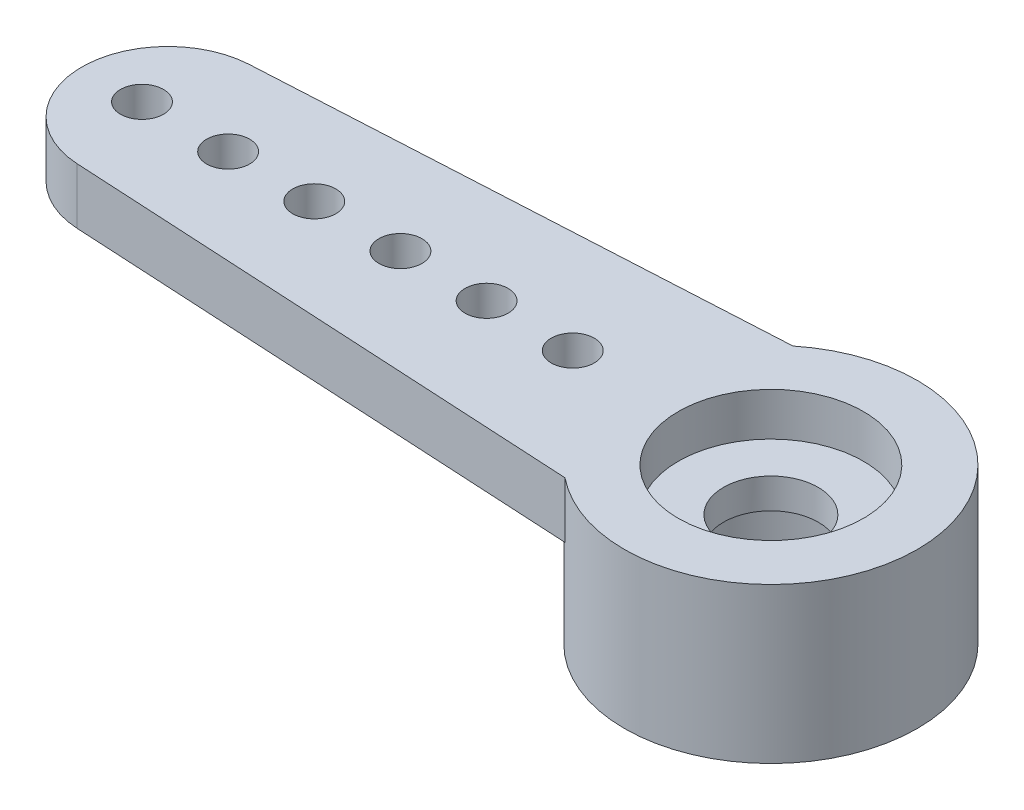
ISO-10303-21;
HEADER;
FILE_DESCRIPTION(('STEP AP214'),'2;1');
FILE_NAME('part.step','',(''),(''),'','','');
FILE_SCHEMA(('AUTOMOTIVE_DESIGN { 1 0 10303 214 1 1 1 1 }'));
ENDSEC;
DATA;
#1=APPLICATION_CONTEXT('core data for automotive mechanical design processes');
#2=APPLICATION_PROTOCOL_DEFINITION('international standard','automotive_design',2000,#1);
#3=PRODUCT_CONTEXT('',#1,'mechanical');
#4=PRODUCT('Part','Part','',(#3));
#5=PRODUCT_RELATED_PRODUCT_CATEGORY('part','',(#4));
#6=PRODUCT_DEFINITION_FORMATION('','',#4);
#7=PRODUCT_DEFINITION_CONTEXT('part definition',#1,'design');
#8=PRODUCT_DEFINITION('design','',#6,#7);
#9=PRODUCT_DEFINITION_SHAPE('','',#8);
#10=(LENGTH_UNIT() NAMED_UNIT(*) SI_UNIT(.MILLI.,.METRE.));
#11=(NAMED_UNIT(*) PLANE_ANGLE_UNIT() SI_UNIT($,.RADIAN.));
#12=(NAMED_UNIT(*) SI_UNIT($,.STERADIAN.) SOLID_ANGLE_UNIT());
#13=UNCERTAINTY_MEASURE_WITH_UNIT(LENGTH_MEASURE(1.E-05),#10,'distance_accuracy_value','');
#14=(GEOMETRIC_REPRESENTATION_CONTEXT(3) GLOBAL_UNCERTAINTY_ASSIGNED_CONTEXT((#13)) GLOBAL_UNIT_ASSIGNED_CONTEXT((#10,
#11,#12)) REPRESENTATION_CONTEXT('',''));
#15=CARTESIAN_POINT('',(0.,0.,0.));
#16=DIRECTION('',(0.,0.,1.));
#17=DIRECTION('',(1.,0.,0.));
#18=AXIS2_PLACEMENT_3D('',#15,#16,#17);
#19=CARTESIAN_POINT('',(5.9,-1.3,-5.67249409819933));
#20=DIRECTION('',(0.,1.,0.));
#21=DIRECTION('',(0.,0.,1.));
#22=AXIS2_PLACEMENT_3D('',#19,#20,#21);
#23=PLANE('',#22);
#24=CARTESIAN_POINT('',(-8.7,-1.3,-5.67249409819933));
#25=DIRECTION('',(0.,1.,0.));
#26=DIRECTION('',(0.,0.,1.));
#27=AXIS2_PLACEMENT_3D('',#24,#25,#26);
#28=CIRCLE('',#27,0.500000000000001);
#29=CARTESIAN_POINT('',(-8.7,-1.3,-5.17249409819933));
#30=VERTEX_POINT('',#29);
#31=EDGE_CURVE('E151',#30,#30,#28,.T.);
#32=ORIENTED_EDGE('',*,*,#31,.T.);
#33=EDGE_LOOP('',(#32));
#34=FACE_BOUND('',#33,.T.);
#35=CARTESIAN_POINT('',(1.3,-1.3,-5.67249409819933));
#36=DIRECTION('',(0.,1.,0.));
#37=DIRECTION('',(0.,0.,1.));
#38=AXIS2_PLACEMENT_3D('',#35,#36,#37);
#39=CIRCLE('',#38,0.500000000000001);
#40=CARTESIAN_POINT('',(1.3,-1.3,-5.17249409819933));
#41=VERTEX_POINT('',#40);
#42=EDGE_CURVE('E145',#41,#41,#39,.T.);
#43=ORIENTED_EDGE('',*,*,#42,.T.);
#44=EDGE_LOOP('',(#43));
#45=FACE_BOUND('',#44,.T.);
#46=CARTESIAN_POINT('',(-0.699999999999998,-1.3,-5.67249409819933));
#47=DIRECTION('',(0.,1.,0.));
#48=DIRECTION('',(0.,0.,1.));
#49=AXIS2_PLACEMENT_3D('',#46,#47,#48);
#50=CIRCLE('',#49,0.500000000000001);
#51=CARTESIAN_POINT('',(-0.699999999999998,-1.3,-5.17249409819933));
#52=VERTEX_POINT('',#51);
#53=EDGE_CURVE('E139',#52,#52,#50,.T.);
#54=ORIENTED_EDGE('',*,*,#53,.T.);
#55=EDGE_LOOP('',(#54));
#56=FACE_BOUND('',#55,.T.);
#57=CARTESIAN_POINT('',(-2.7,-1.3,-5.67249409819933));
#58=DIRECTION('',(0.,1.,0.));
#59=DIRECTION('',(0.,0.,1.));
#60=AXIS2_PLACEMENT_3D('',#57,#58,#59);
#61=CIRCLE('',#60,0.5);
#62=CARTESIAN_POINT('',(-2.7,-1.3,-5.17249409819933));
#63=VERTEX_POINT('',#62);
#64=EDGE_CURVE('E133',#63,#63,#61,.T.);
#65=ORIENTED_EDGE('',*,*,#64,.T.);
#66=EDGE_LOOP('',(#65));
#67=FACE_BOUND('',#66,.T.);
#68=CARTESIAN_POINT('',(-4.7,-1.3,-5.67249409819933));
#69=DIRECTION('',(0.,1.,0.));
#70=DIRECTION('',(0.,0.,1.));
#71=AXIS2_PLACEMENT_3D('',#68,#69,#70);
#72=CIRCLE('',#71,0.500000000000001);
#73=CARTESIAN_POINT('',(-4.7,-1.3,-5.17249409819933));
#74=VERTEX_POINT('',#73);
#75=EDGE_CURVE('E127',#74,#74,#72,.T.);
#76=ORIENTED_EDGE('',*,*,#75,.T.);
#77=EDGE_LOOP('',(#76));
#78=FACE_BOUND('',#77,.T.);
#79=CARTESIAN_POINT('',(-6.7,-1.3,-5.67249409819933));
#80=DIRECTION('',(0.,1.,0.));
#81=DIRECTION('',(0.,0.,1.));
#82=AXIS2_PLACEMENT_3D('',#79,#80,#81);
#83=CIRCLE('',#82,0.500000000000001);
#84=CARTESIAN_POINT('',(-6.7,-1.3,-5.17249409819933));
#85=VERTEX_POINT('',#84);
#86=EDGE_CURVE('E120',#85,#85,#83,.T.);
#87=ORIENTED_EDGE('',*,*,#86,.T.);
#88=EDGE_LOOP('',(#87));
#89=FACE_BOUND('',#88,.T.);
#90=CARTESIAN_POINT('',(5.9,-1.3,-5.67249409819933));
#91=DIRECTION('',(0.,-1.,0.));
#92=DIRECTION('',(0.,0.,-1.));
#93=AXIS2_PLACEMENT_3D('',#90,#91,#92);
#94=CIRCLE('',#93,3.40000000000004);
#95=CARTESIAN_POINT('',(3.76674544416284,-1.3,-3.025));
#96=VERTEX_POINT('',#95);
#97=CARTESIAN_POINT('',(3.76674544416284,-1.3,-8.31998819639866));
#98=VERTEX_POINT('',#97);
#99=EDGE_CURVE('E75',#96,#98,#94,.T.);
#100=ORIENTED_EDGE('',*,*,#99,.F.);
#101=DIRECTION('',(0.998528178597838,0.,0.0542353809434821));
#102=VECTOR('',#101,1.);
#103=CARTESIAN_POINT('',(-8.20847076188695,-1.3,-3.67543774100366));
#104=LINE('',#103,#102);
#105=CARTESIAN_POINT('',(-8.20847076188695,-1.3,-3.67543774100365));
#106=VERTEX_POINT('',#105);
#107=EDGE_CURVE('E82',#106,#96,#104,.T.);
#108=ORIENTED_EDGE('',*,*,#107,.F.);
#109=CARTESIAN_POINT('',(-8.09999999999999,-1.3,-5.67249409819933));
#110=DIRECTION('',(0.,1.,0.));
#111=DIRECTION('',(0.,0.,1.));
#112=AXIS2_PLACEMENT_3D('',#109,#110,#111);
#113=CIRCLE('',#112,2.);
#114=CARTESIAN_POINT('',(-8.20847076188695,-1.3,-7.66955045539501));
#115=VERTEX_POINT('',#114);
#116=EDGE_CURVE('E94',#115,#106,#113,.T.);
#117=ORIENTED_EDGE('',*,*,#116,.F.);
#118=DIRECTION('',(-0.998528178597838,0.,0.0542353809434817));
#119=VECTOR('',#118,1.);
#120=CARTESIAN_POINT('',(3.76674544416284,-1.3,-8.31998819639866));
#121=LINE('',#120,#119);
#122=EDGE_CURVE('E84',#98,#115,#121,.T.);
#123=ORIENTED_EDGE('',*,*,#122,.F.);
#124=EDGE_LOOP('',(#100,#108,#117,#123));
#125=FACE_BOUND('',#124,.T.);
#126=ADVANCED_FACE('F35',(#34,#45,#56,#67,#78,#89,#125),#23,.F.);
#127=CARTESIAN_POINT('',(5.9,-1.3,-5.67249409819933));
#128=DIRECTION('',(0.,1.,0.));
#129=DIRECTION('',(0.,0.,1.));
#130=AXIS2_PLACEMENT_3D('',#127,#128,#129);
#131=CYLINDRICAL_SURFACE('',#130,1.1);
#132=CARTESIAN_POINT('',(5.9,-1.,-5.67249409819933));
#133=DIRECTION('',(0.,1.,0.));
#134=DIRECTION('',(0.,0.,1.));
#135=AXIS2_PLACEMENT_3D('',#132,#133,#134);
#136=CIRCLE('',#135,1.1);
#137=CARTESIAN_POINT('',(5.9,-1.,-4.57249409819933));
#138=VERTEX_POINT('',#137);
#139=EDGE_CURVE('E109',#138,#138,#136,.F.);
#140=ORIENTED_EDGE('',*,*,#139,.F.);
#141=EDGE_LOOP('',(#140));
#142=FACE_BOUND('',#141,.T.);
#143=CARTESIAN_POINT('',(5.9,-1.7,-5.67249409819933));
#144=DIRECTION('',(0.,-1.,0.));
#145=DIRECTION('',(0.,0.,-1.));
#146=AXIS2_PLACEMENT_3D('',#143,#144,#145);
#147=CIRCLE('',#146,1.1);
#148=CARTESIAN_POINT('',(5.9,-1.7,-6.77249409819933));
#149=VERTEX_POINT('',#148);
#150=EDGE_CURVE('E237',#149,#149,#147,.F.);
#151=ORIENTED_EDGE('',*,*,#150,.F.);
#152=EDGE_LOOP('',(#151));
#153=FACE_BOUND('',#152,.T.);
#154=ADVANCED_FACE('F185',(#142,#153),#131,.F.);
#155=CARTESIAN_POINT('',(5.9,-1.3,-5.67249409819933));
#156=DIRECTION('',(0.,1.,0.));
#157=DIRECTION('',(0.,0.,1.));
#158=AXIS2_PLACEMENT_3D('',#155,#156,#157);
#159=CYLINDRICAL_SURFACE('',#158,3.40000000000004);
#160=CARTESIAN_POINT('',(5.9,0.,-5.67249409819933));
#161=DIRECTION('',(0.,1.,0.));
#162=DIRECTION('',(0.,0.,1.));
#163=AXIS2_PLACEMENT_3D('',#160,#161,#162);
#164=CIRCLE('',#163,3.40000000000004);
#165=CARTESIAN_POINT('',(3.76674544416284,0.,-3.025));
#166=VERTEX_POINT('',#165);
#167=CARTESIAN_POINT('',(3.76674544416284,0.,-8.31998819639866));
#168=VERTEX_POINT('',#167);
#169=EDGE_CURVE('E90',#166,#168,#164,.T.);
#170=ORIENTED_EDGE('',*,*,#169,.F.);
#171=DIRECTION('',(0.,1.,0.));
#172=VECTOR('',#171,1.);
#173=CARTESIAN_POINT('',(3.76674544416284,-1.3,-3.025));
#174=LINE('',#173,#172);
#175=EDGE_CURVE('E12',#96,#166,#174,.T.);
#176=ORIENTED_EDGE('',*,*,#175,.F.);
#177=ORIENTED_EDGE('',*,*,#99,.T.);
#178=DIRECTION('',(0.,1.,0.));
#179=VECTOR('',#178,1.);
#180=CARTESIAN_POINT('',(3.76674544416284,-1.3,-8.31998819639866));
#181=LINE('',#180,#179);
#182=EDGE_CURVE('E93',#98,#168,#181,.T.);
#183=ORIENTED_EDGE('',*,*,#182,.T.);
#184=EDGE_LOOP('',(#170,#176,#177,#183));
#185=FACE_BOUND('',#184,.T.);
#186=CARTESIAN_POINT('',(5.9,-3.6,-5.67249409819933));
#187=DIRECTION('',(0.,1.,0.));
#188=DIRECTION('',(0.,0.,1.));
#189=AXIS2_PLACEMENT_3D('',#186,#187,#188);
#190=CIRCLE('',#189,3.40000000000004);
#191=CARTESIAN_POINT('',(5.9,-3.6,-2.27249409819929));
#192=VERTEX_POINT('',#191);
#193=EDGE_CURVE('E85',#192,#192,#190,.T.);
#194=ORIENTED_EDGE('',*,*,#193,.T.);
#195=EDGE_LOOP('',(#194));
#196=FACE_BOUND('',#195,.T.);
#197=ADVANCED_FACE('F37',(#185,#196),#159,.T.);
#198=CARTESIAN_POINT('',(-8.20847076188695,-1.3,-3.67543774100366));
#199=DIRECTION('',(-0.0542353809434821,0.,0.998528178597838));
#200=DIRECTION('',(0.998528178597838,0.,0.0542353809434821));
#201=AXIS2_PLACEMENT_3D('',#198,#199,#200);
#202=PLANE('',#201);
#203=DIRECTION('',(0.998528178597838,0.,0.0542353809434821));
#204=VECTOR('',#203,1.);
#205=CARTESIAN_POINT('',(-8.20847076188695,0.,-3.67543774100366));
#206=LINE('',#205,#204);
#207=CARTESIAN_POINT('',(-8.20847076188695,0.,-3.67543774100365));
#208=VERTEX_POINT('',#207);
#209=EDGE_CURVE('E104',#208,#166,#206,.T.);
#210=ORIENTED_EDGE('',*,*,#209,.F.);
#211=DIRECTION('',(0.,1.,0.));
#212=VECTOR('',#211,1.);
#213=CARTESIAN_POINT('',(-8.20847076188695,-1.3,-3.67543774100365));
#214=LINE('',#213,#212);
#215=EDGE_CURVE('E45',#106,#208,#214,.T.);
#216=ORIENTED_EDGE('',*,*,#215,.F.);
#217=ORIENTED_EDGE('',*,*,#107,.T.);
#218=ORIENTED_EDGE('',*,*,#175,.T.);
#219=EDGE_LOOP('',(#210,#216,#217,#218));
#220=FACE_BOUND('',#219,.T.);
#221=ADVANCED_FACE('F92',(#220),#202,.T.);
#222=CARTESIAN_POINT('',(-8.09999999999999,-1.3,-5.67249409819933));
#223=DIRECTION('',(0.,1.,0.));
#224=DIRECTION('',(0.,0.,1.));
#225=AXIS2_PLACEMENT_3D('',#222,#223,#224);
#226=CYLINDRICAL_SURFACE('',#225,2.);
#227=CARTESIAN_POINT('',(-8.09999999999999,0.,-5.67249409819933));
#228=DIRECTION('',(0.,1.,0.));
#229=DIRECTION('',(0.,0.,1.));
#230=AXIS2_PLACEMENT_3D('',#227,#228,#229);
#231=CIRCLE('',#230,2.);
#232=CARTESIAN_POINT('',(-8.20847076188695,0.,-7.66955045539501));
#233=VERTEX_POINT('',#232);
#234=EDGE_CURVE('E160',#233,#208,#231,.T.);
#235=ORIENTED_EDGE('',*,*,#234,.F.);
#236=DIRECTION('',(0.,1.,0.));
#237=VECTOR('',#236,1.);
#238=CARTESIAN_POINT('',(-8.20847076188695,-1.3,-7.66955045539501));
#239=LINE('',#238,#237);
#240=EDGE_CURVE('E95',#115,#233,#239,.T.);
#241=ORIENTED_EDGE('',*,*,#240,.F.);
#242=ORIENTED_EDGE('',*,*,#116,.T.);
#243=ORIENTED_EDGE('',*,*,#215,.T.);
#244=EDGE_LOOP('',(#235,#241,#242,#243));
#245=FACE_BOUND('',#244,.T.);
#246=ADVANCED_FACE('F166',(#245),#226,.T.);
#247=CARTESIAN_POINT('',(3.76674544416284,-1.3,-8.31998819639866));
#248=DIRECTION('',(-0.0542353809434817,0.,-0.998528178597838));
#249=DIRECTION('',(-0.998528178597838,0.,0.0542353809434817));
#250=AXIS2_PLACEMENT_3D('',#247,#248,#249);
#251=PLANE('',#250);
#252=DIRECTION('',(-0.998528178597838,0.,0.0542353809434817));
#253=VECTOR('',#252,1.);
#254=CARTESIAN_POINT('',(3.76674544416284,0.,-8.31998819639866));
#255=LINE('',#254,#253);
#256=EDGE_CURVE('E157',#168,#233,#255,.T.);
#257=ORIENTED_EDGE('',*,*,#256,.F.);
#258=ORIENTED_EDGE('',*,*,#182,.F.);
#259=ORIENTED_EDGE('',*,*,#122,.T.);
#260=ORIENTED_EDGE('',*,*,#240,.T.);
#261=EDGE_LOOP('',(#257,#258,#259,#260));
#262=FACE_BOUND('',#261,.T.);
#263=ADVANCED_FACE('F165',(#262),#251,.T.);
#264=CARTESIAN_POINT('',(5.9,0.,-5.67249409819933));
#265=DIRECTION('',(0.,1.,0.));
#266=DIRECTION('',(0.,0.,1.));
#267=AXIS2_PLACEMENT_3D('',#264,#265,#266);
#268=PLANE('',#267);
#269=CARTESIAN_POINT('',(5.9,0.,-5.67249409819933));
#270=DIRECTION('',(0.,1.,0.));
#271=DIRECTION('',(0.,0.,1.));
#272=AXIS2_PLACEMENT_3D('',#269,#270,#271);
#273=CIRCLE('',#272,2.15);
#274=CARTESIAN_POINT('',(5.9,0.,-3.52249409819933));
#275=VERTEX_POINT('',#274);
#276=EDGE_CURVE('E117',#275,#275,#273,.T.);
#277=ORIENTED_EDGE('',*,*,#276,.F.);
#278=EDGE_LOOP('',(#277));
#279=FACE_BOUND('',#278,.T.);
#280=CARTESIAN_POINT('',(-6.7,0.,-5.67249409819933));
#281=DIRECTION('',(0.,1.,0.));
#282=DIRECTION('',(0.,0.,1.));
#283=AXIS2_PLACEMENT_3D('',#280,#281,#282);
#284=CIRCLE('',#283,0.500000000000001);
#285=CARTESIAN_POINT('',(-6.7,0.,-5.17249409819933));
#286=VERTEX_POINT('',#285);
#287=EDGE_CURVE('E124',#286,#286,#284,.T.);
#288=ORIENTED_EDGE('',*,*,#287,.F.);
#289=EDGE_LOOP('',(#288));
#290=FACE_BOUND('',#289,.T.);
#291=CARTESIAN_POINT('',(-4.7,0.,-5.67249409819933));
#292=DIRECTION('',(0.,1.,0.));
#293=DIRECTION('',(0.,0.,1.));
#294=AXIS2_PLACEMENT_3D('',#291,#292,#293);
#295=CIRCLE('',#294,0.500000000000001);
#296=CARTESIAN_POINT('',(-4.7,0.,-5.17249409819933));
#297=VERTEX_POINT('',#296);
#298=EDGE_CURVE('E123',#297,#297,#295,.T.);
#299=ORIENTED_EDGE('',*,*,#298,.F.);
#300=EDGE_LOOP('',(#299));
#301=FACE_BOUND('',#300,.T.);
#302=CARTESIAN_POINT('',(-2.7,0.,-5.67249409819933));
#303=DIRECTION('',(0.,1.,0.));
#304=DIRECTION('',(0.,0.,1.));
#305=AXIS2_PLACEMENT_3D('',#302,#303,#304);
#306=CIRCLE('',#305,0.5);
#307=CARTESIAN_POINT('',(-2.7,0.,-5.17249409819933));
#308=VERTEX_POINT('',#307);
#309=EDGE_CURVE('E130',#308,#308,#306,.T.);
#310=ORIENTED_EDGE('',*,*,#309,.F.);
#311=EDGE_LOOP('',(#310));
#312=FACE_BOUND('',#311,.T.);
#313=CARTESIAN_POINT('',(-0.699999999999998,0.,-5.67249409819933));
#314=DIRECTION('',(0.,1.,0.));
#315=DIRECTION('',(0.,0.,1.));
#316=AXIS2_PLACEMENT_3D('',#313,#314,#315);
#317=CIRCLE('',#316,0.500000000000001);
#318=CARTESIAN_POINT('',(-0.699999999999998,0.,-5.17249409819933));
#319=VERTEX_POINT('',#318);
#320=EDGE_CURVE('E136',#319,#319,#317,.T.);
#321=ORIENTED_EDGE('',*,*,#320,.F.);
#322=EDGE_LOOP('',(#321));
#323=FACE_BOUND('',#322,.T.);
#324=CARTESIAN_POINT('',(1.3,0.,-5.67249409819933));
#325=DIRECTION('',(0.,1.,0.));
#326=DIRECTION('',(0.,0.,1.));
#327=AXIS2_PLACEMENT_3D('',#324,#325,#326);
#328=CIRCLE('',#327,0.500000000000001);
#329=CARTESIAN_POINT('',(1.3,0.,-5.17249409819933));
#330=VERTEX_POINT('',#329);
#331=EDGE_CURVE('E142',#330,#330,#328,.T.);
#332=ORIENTED_EDGE('',*,*,#331,.F.);
#333=EDGE_LOOP('',(#332));
#334=FACE_BOUND('',#333,.T.);
#335=CARTESIAN_POINT('',(-8.7,0.,-5.67249409819933));
#336=DIRECTION('',(0.,1.,0.));
#337=DIRECTION('',(0.,0.,1.));
#338=AXIS2_PLACEMENT_3D('',#335,#336,#337);
#339=CIRCLE('',#338,0.500000000000001);
#340=CARTESIAN_POINT('',(-8.7,0.,-5.17249409819933));
#341=VERTEX_POINT('',#340);
#342=EDGE_CURVE('E148',#341,#341,#339,.T.);
#343=ORIENTED_EDGE('',*,*,#342,.F.);
#344=EDGE_LOOP('',(#343));
#345=FACE_BOUND('',#344,.T.);
#346=ORIENTED_EDGE('',*,*,#169,.T.);
#347=ORIENTED_EDGE('',*,*,#256,.T.);
#348=ORIENTED_EDGE('',*,*,#234,.T.);
#349=ORIENTED_EDGE('',*,*,#209,.T.);
#350=EDGE_LOOP('',(#346,#347,#348,#349));
#351=FACE_BOUND('',#350,.T.);
#352=ADVANCED_FACE('F168',(#279,#290,#301,#312,#323,#334,#345,#351),#268,.T.);
#353=CARTESIAN_POINT('',(-8.7,-1.3,-5.67249409819933));
#354=DIRECTION('',(0.,1.,0.));
#355=DIRECTION('',(0.,0.,1.));
#356=AXIS2_PLACEMENT_3D('',#353,#354,#355);
#357=CYLINDRICAL_SURFACE('',#356,0.500000000000001);
#358=ORIENTED_EDGE('',*,*,#31,.F.);
#359=EDGE_LOOP('',(#358));
#360=FACE_BOUND('',#359,.T.);
#361=ORIENTED_EDGE('',*,*,#342,.T.);
#362=EDGE_LOOP('',(#361));
#363=FACE_BOUND('',#362,.T.);
#364=ADVANCED_FACE('F170',(#360,#363),#357,.F.);
#365=CARTESIAN_POINT('',(1.3,-1.3,-5.67249409819933));
#366=DIRECTION('',(0.,1.,0.));
#367=DIRECTION('',(0.,0.,1.));
#368=AXIS2_PLACEMENT_3D('',#365,#366,#367);
#369=CYLINDRICAL_SURFACE('',#368,0.500000000000001);
#370=ORIENTED_EDGE('',*,*,#42,.F.);
#371=EDGE_LOOP('',(#370));
#372=FACE_BOUND('',#371,.T.);
#373=ORIENTED_EDGE('',*,*,#331,.T.);
#374=EDGE_LOOP('',(#373));
#375=FACE_BOUND('',#374,.T.);
#376=ADVANCED_FACE('F177',(#372,#375),#369,.F.);
#377=CARTESIAN_POINT('',(-0.699999999999998,-1.3,-5.67249409819933));
#378=DIRECTION('',(0.,1.,0.));
#379=DIRECTION('',(0.,0.,1.));
#380=AXIS2_PLACEMENT_3D('',#377,#378,#379);
#381=CYLINDRICAL_SURFACE('',#380,0.500000000000001);
#382=ORIENTED_EDGE('',*,*,#53,.F.);
#383=EDGE_LOOP('',(#382));
#384=FACE_BOUND('',#383,.T.);
#385=ORIENTED_EDGE('',*,*,#320,.T.);
#386=EDGE_LOOP('',(#385));
#387=FACE_BOUND('',#386,.T.);
#388=ADVANCED_FACE('F196',(#384,#387),#381,.F.);
#389=CARTESIAN_POINT('',(-2.7,-1.3,-5.67249409819933));
#390=DIRECTION('',(0.,1.,0.));
#391=DIRECTION('',(0.,0.,1.));
#392=AXIS2_PLACEMENT_3D('',#389,#390,#391);
#393=CYLINDRICAL_SURFACE('',#392,0.5);
#394=ORIENTED_EDGE('',*,*,#64,.F.);
#395=EDGE_LOOP('',(#394));
#396=FACE_BOUND('',#395,.T.);
#397=ORIENTED_EDGE('',*,*,#309,.T.);
#398=EDGE_LOOP('',(#397));
#399=FACE_BOUND('',#398,.T.);
#400=ADVANCED_FACE('F200',(#396,#399),#393,.F.);
#401=CARTESIAN_POINT('',(-4.7,-1.3,-5.67249409819933));
#402=DIRECTION('',(0.,1.,0.));
#403=DIRECTION('',(0.,0.,1.));
#404=AXIS2_PLACEMENT_3D('',#401,#402,#403);
#405=CYLINDRICAL_SURFACE('',#404,0.500000000000001);
#406=ORIENTED_EDGE('',*,*,#75,.F.);
#407=EDGE_LOOP('',(#406));
#408=FACE_BOUND('',#407,.T.);
#409=ORIENTED_EDGE('',*,*,#298,.T.);
#410=EDGE_LOOP('',(#409));
#411=FACE_BOUND('',#410,.T.);
#412=ADVANCED_FACE('F204',(#408,#411),#405,.F.);
#413=CARTESIAN_POINT('',(-6.7,-1.3,-5.67249409819933));
#414=DIRECTION('',(0.,1.,0.));
#415=DIRECTION('',(0.,0.,1.));
#416=AXIS2_PLACEMENT_3D('',#413,#414,#415);
#417=CYLINDRICAL_SURFACE('',#416,0.500000000000001);
#418=ORIENTED_EDGE('',*,*,#86,.F.);
#419=EDGE_LOOP('',(#418));
#420=FACE_BOUND('',#419,.T.);
#421=ORIENTED_EDGE('',*,*,#287,.T.);
#422=EDGE_LOOP('',(#421));
#423=FACE_BOUND('',#422,.T.);
#424=ADVANCED_FACE('F208',(#420,#423),#417,.F.);
#425=CARTESIAN_POINT('',(5.9,-1.,-5.67249409819933));
#426=DIRECTION('',(0.,1.,0.));
#427=DIRECTION('',(0.,0.,1.));
#428=AXIS2_PLACEMENT_3D('',#425,#426,#427);
#429=PLANE('',#428);
#430=CARTESIAN_POINT('',(5.9,-1.,-5.67249409819933));
#431=DIRECTION('',(0.,1.,0.));
#432=DIRECTION('',(0.,0.,1.));
#433=AXIS2_PLACEMENT_3D('',#430,#431,#432);
#434=CIRCLE('',#433,2.15);
#435=CARTESIAN_POINT('',(5.9,-1.,-3.52249409819933));
#436=VERTEX_POINT('',#435);
#437=EDGE_CURVE('E114',#436,#436,#434,.T.);
#438=ORIENTED_EDGE('',*,*,#437,.T.);
#439=EDGE_LOOP('',(#438));
#440=FACE_BOUND('',#439,.T.);
#441=ORIENTED_EDGE('',*,*,#139,.T.);
#442=EDGE_LOOP('',(#441));
#443=FACE_BOUND('',#442,.T.);
#444=ADVANCED_FACE('F211',(#440,#443),#429,.T.);
#445=CARTESIAN_POINT('',(5.9,-1.,-5.67249409819933));
#446=DIRECTION('',(0.,1.,0.));
#447=DIRECTION('',(0.,0.,1.));
#448=AXIS2_PLACEMENT_3D('',#445,#446,#447);
#449=CYLINDRICAL_SURFACE('',#448,2.15);
#450=ORIENTED_EDGE('',*,*,#437,.F.);
#451=EDGE_LOOP('',(#450));
#452=FACE_BOUND('',#451,.T.);
#453=ORIENTED_EDGE('',*,*,#276,.T.);
#454=EDGE_LOOP('',(#453));
#455=FACE_BOUND('',#454,.T.);
#456=ADVANCED_FACE('F214',(#452,#455),#449,.F.);
#457=CARTESIAN_POINT('',(5.9,-3.6,-5.67249409819933));
#458=DIRECTION('',(0.,1.,0.));
#459=DIRECTION('',(0.,0.,1.));
#460=AXIS2_PLACEMENT_3D('',#457,#458,#459);
#461=PLANE('',#460);
#462=CARTESIAN_POINT('',(5.9,-3.6,-5.67249409819933));
#463=DIRECTION('',(0.,-1.,0.));
#464=DIRECTION('',(0.,0.,-1.));
#465=AXIS2_PLACEMENT_3D('',#462,#463,#464);
#466=CIRCLE('',#465,2.35);
#467=CARTESIAN_POINT('',(5.9,-3.6,-8.02249409819933));
#468=VERTEX_POINT('',#467);
#469=EDGE_CURVE('E240',#468,#468,#466,.T.);
#470=ORIENTED_EDGE('',*,*,#469,.F.);
#471=EDGE_LOOP('',(#470));
#472=FACE_BOUND('',#471,.T.);
#473=ORIENTED_EDGE('',*,*,#193,.F.);
#474=EDGE_LOOP('',(#473));
#475=FACE_BOUND('',#474,.T.);
#476=ADVANCED_FACE('F217',(#472,#475),#461,.F.);
#477=CARTESIAN_POINT('',(5.9,-1.7,-5.67249409819933));
#478=DIRECTION('',(0.,-1.,0.));
#479=DIRECTION('',(0.,0.,-1.));
#480=AXIS2_PLACEMENT_3D('',#477,#478,#479);
#481=CYLINDRICAL_SURFACE('',#480,2.35);
#482=CARTESIAN_POINT('',(5.9,-1.7,-5.67249409819933));
#483=DIRECTION('',(0.,-1.,0.));
#484=DIRECTION('',(0.,0.,-1.));
#485=AXIS2_PLACEMENT_3D('',#482,#483,#484);
#486=CIRCLE('',#485,2.35);
#487=CARTESIAN_POINT('',(5.9,-1.7,-8.02249409819933));
#488=VERTEX_POINT('',#487);
#489=EDGE_CURVE('E86',#488,#488,#486,.T.);
#490=CARTESIAN_POINT('',(5.9,-1.7,-8.02249409819933));
#491=CARTESIAN_POINT('',(5.9,-1.71979166666667,-8.02249409819933));
#492=CARTESIAN_POINT('',(5.9,-1.73958333333333,-8.02249409819933));
#493=CARTESIAN_POINT('',(5.9,-1.77916666666667,-8.02249409819933));
#494=CARTESIAN_POINT('',(5.9,-1.79895833333333,-8.02249409819933));
#495=CARTESIAN_POINT('',(5.9,-1.83854166666667,-8.02249409819933));
#496=CARTESIAN_POINT('',(5.9,-1.85833333333333,-8.02249409819933));
#497=CARTESIAN_POINT('',(5.9,-1.89791666666667,-8.02249409819933));
#498=CARTESIAN_POINT('',(5.9,-1.91770833333333,-8.02249409819933));
#499=CARTESIAN_POINT('',(5.9,-1.95729166666667,-8.02249409819933));
#500=CARTESIAN_POINT('',(5.9,-1.97708333333333,-8.02249409819933));
#501=CARTESIAN_POINT('',(5.9,-2.01666666666667,-8.02249409819933));
#502=CARTESIAN_POINT('',(5.9,-2.03645833333333,-8.02249409819933));
#503=CARTESIAN_POINT('',(5.9,-2.07604166666667,-8.02249409819933));
#504=CARTESIAN_POINT('',(5.9,-2.09583333333333,-8.02249409819933));
#505=CARTESIAN_POINT('',(5.9,-2.13541666666667,-8.02249409819933));
#506=CARTESIAN_POINT('',(5.9,-2.15520833333333,-8.02249409819933));
#507=CARTESIAN_POINT('',(5.9,-2.19479166666667,-8.02249409819933));
#508=CARTESIAN_POINT('',(5.9,-2.21458333333333,-8.02249409819933));
#509=CARTESIAN_POINT('',(5.9,-2.25416666666667,-8.02249409819933));
#510=CARTESIAN_POINT('',(5.9,-2.27395833333333,-8.02249409819933));
#511=CARTESIAN_POINT('',(5.9,-2.31354166666667,-8.02249409819933));
#512=CARTESIAN_POINT('',(5.9,-2.33333333333333,-8.02249409819933));
#513=CARTESIAN_POINT('',(5.9,-2.37291666666667,-8.02249409819933));
#514=CARTESIAN_POINT('',(5.9,-2.39270833333333,-8.02249409819933));
#515=CARTESIAN_POINT('',(5.9,-2.43229166666667,-8.02249409819933));
#516=CARTESIAN_POINT('',(5.9,-2.45208333333333,-8.02249409819933));
#517=CARTESIAN_POINT('',(5.9,-2.49166666666667,-8.02249409819933));
#518=CARTESIAN_POINT('',(5.9,-2.51145833333333,-8.02249409819933));
#519=CARTESIAN_POINT('',(5.9,-2.55104166666667,-8.02249409819933));
#520=CARTESIAN_POINT('',(5.9,-2.57083333333333,-8.02249409819933));
#521=CARTESIAN_POINT('',(5.9,-2.61041666666667,-8.02249409819933));
#522=CARTESIAN_POINT('',(5.9,-2.63020833333333,-8.02249409819933));
#523=CARTESIAN_POINT('',(5.9,-2.66979166666667,-8.02249409819933));
#524=CARTESIAN_POINT('',(5.9,-2.68958333333333,-8.02249409819933));
#525=CARTESIAN_POINT('',(5.9,-2.72916666666667,-8.02249409819933));
#526=CARTESIAN_POINT('',(5.9,-2.74895833333333,-8.02249409819933));
#527=CARTESIAN_POINT('',(5.9,-2.78854166666667,-8.02249409819933));
#528=CARTESIAN_POINT('',(5.9,-2.80833333333333,-8.02249409819933));
#529=CARTESIAN_POINT('',(5.9,-2.84791666666667,-8.02249409819933));
#530=CARTESIAN_POINT('',(5.9,-2.86770833333333,-8.02249409819933));
#531=CARTESIAN_POINT('',(5.9,-2.90729166666667,-8.02249409819933));
#532=CARTESIAN_POINT('',(5.9,-2.92708333333333,-8.02249409819933));
#533=CARTESIAN_POINT('',(5.9,-2.96666666666667,-8.02249409819933));
#534=CARTESIAN_POINT('',(5.9,-2.98645833333333,-8.02249409819933));
#535=CARTESIAN_POINT('',(5.9,-3.02604166666667,-8.02249409819933));
#536=CARTESIAN_POINT('',(5.9,-3.04583333333333,-8.02249409819933));
#537=CARTESIAN_POINT('',(5.9,-3.08541666666667,-8.02249409819933));
#538=CARTESIAN_POINT('',(5.9,-3.10520833333333,-8.02249409819933));
#539=CARTESIAN_POINT('',(5.9,-3.14479166666667,-8.02249409819933));
#540=CARTESIAN_POINT('',(5.9,-3.16458333333333,-8.02249409819933));
#541=CARTESIAN_POINT('',(5.9,-3.20416666666667,-8.02249409819933));
#542=CARTESIAN_POINT('',(5.9,-3.22395833333333,-8.02249409819933));
#543=CARTESIAN_POINT('',(5.9,-3.26354166666667,-8.02249409819933));
#544=CARTESIAN_POINT('',(5.9,-3.28333333333333,-8.02249409819933));
#545=CARTESIAN_POINT('',(5.9,-3.32291666666667,-8.02249409819933));
#546=CARTESIAN_POINT('',(5.9,-3.34270833333333,-8.02249409819933));
#547=CARTESIAN_POINT('',(5.9,-3.38229166666667,-8.02249409819933));
#548=CARTESIAN_POINT('',(5.9,-3.40208333333333,-8.02249409819933));
#549=CARTESIAN_POINT('',(5.9,-3.44166666666667,-8.02249409819933));
#550=CARTESIAN_POINT('',(5.9,-3.46145833333333,-8.02249409819933));
#551=CARTESIAN_POINT('',(5.9,-3.50104166666667,-8.02249409819933));
#552=CARTESIAN_POINT('',(5.9,-3.52083333333333,-8.02249409819933));
#553=CARTESIAN_POINT('',(5.9,-3.56041666666667,-8.02249409819933));
#554=CARTESIAN_POINT('',(5.9,-3.58020833333333,-8.02249409819933));
#555=CARTESIAN_POINT('',(5.9,-3.6,-8.02249409819933));
#556=B_SPLINE_CURVE_WITH_KNOTS('',3,(#490,#491,#492,#493,#494,#495,#496,#497,#498,#499,#500,
#501,#502,#503,#504,#505,#506,#507,#508,#509,#510,#511,#512,#513,#514,#515,#516,#517,#518,#519,
#520,#521,#522,#523,#524,#525,#526,#527,#528,#529,#530,#531,#532,#533,#534,#535,#536,#537,#538,
#539,#540,#541,#542,#543,#544,#545,#546,#547,#548,#549,#550,#551,#552,#553,#554,#555),
.UNSPECIFIED.,.F.,.F.,(4,2,2,2,2,2,2,2,2,2,2,2,2,2,2,2,2,2,2,2,2,2,2,2,2,2,2,2,2,2,2,2,4),(0.,
0.0593750000000002,0.11875,0.178125,0.2375,0.296875,0.35625,0.415625,0.475,0.534375,0.59375,
0.653125,0.7125,0.771875,0.83125,0.890625,0.95,1.009375,1.06875,1.128125,1.1875,1.246875,
1.30625,1.365625,1.425,1.484375,1.54375,1.603125,1.6625,1.721875,1.78125,1.840625,1.9),.UNSPECIFIED.);
#557=EDGE_CURVE('BSEAM224',#488,#468,#556,.T.);
#558=ORIENTED_EDGE('',*,*,#489,.F.);
#559=ORIENTED_EDGE('',*,*,#469,.T.);
#560=ORIENTED_EDGE('',*,*,#557,.T.);
#561=ORIENTED_EDGE('',*,*,#557,.F.);
#562=EDGE_LOOP('',(#558,#560,#559,#561));
#563=FACE_BOUND('',#562,.T.);
#564=ADVANCED_FACE('F224',(#563),#481,.F.);
#565=CARTESIAN_POINT('',(5.9,-1.7,-5.67249409819933));
#566=DIRECTION('',(0.,-1.,0.));
#567=DIRECTION('',(0.,0.,-1.));
#568=AXIS2_PLACEMENT_3D('',#565,#566,#567);
#569=PLANE('',#568);
#570=ORIENTED_EDGE('',*,*,#150,.T.);
#571=EDGE_LOOP('',(#570));
#572=FACE_BOUND('',#571,.T.);
#573=ORIENTED_EDGE('',*,*,#489,.T.);
#574=EDGE_LOOP('',(#573));
#575=FACE_BOUND('',#574,.T.);
#576=ADVANCED_FACE('F228',(#572,#575),#569,.T.);
#577=CLOSED_SHELL('',(#126,#154,#197,#221,#246,#263,#352,#364,#376,#388,#400,#412,#424,#444,
#456,#476,#564,#576));
#578=MANIFOLD_SOLID_BREP('B2',#577);
#579=ADVANCED_BREP_SHAPE_REPRESENTATION('',(#18,#578),#14);
#580=SHAPE_DEFINITION_REPRESENTATION(#9,#579);
ENDSEC;
END-ISO-10303-21;
